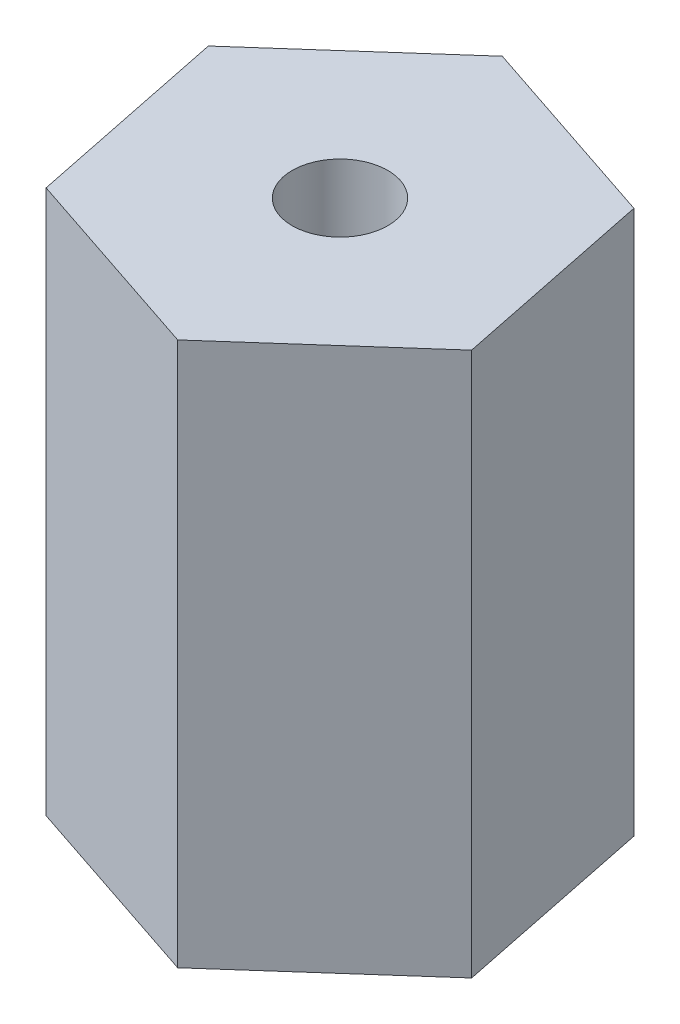
ISO-10303-21;
HEADER;
FILE_DESCRIPTION(('STEP AP214'),'2;1');
FILE_NAME('part.step','',(''),(''),'','','');
FILE_SCHEMA(('AUTOMOTIVE_DESIGN { 1 0 10303 214 1 1 1 1 }'));
ENDSEC;
DATA;
#1=APPLICATION_CONTEXT('core data for automotive mechanical design processes');
#2=APPLICATION_PROTOCOL_DEFINITION('international standard','automotive_design',2000,#1);
#3=PRODUCT_CONTEXT('',#1,'mechanical');
#4=PRODUCT('Part','Part','',(#3));
#5=PRODUCT_RELATED_PRODUCT_CATEGORY('part','',(#4));
#6=PRODUCT_DEFINITION_FORMATION('','',#4);
#7=PRODUCT_DEFINITION_CONTEXT('part definition',#1,'design');
#8=PRODUCT_DEFINITION('design','',#6,#7);
#9=PRODUCT_DEFINITION_SHAPE('','',#8);
#10=(LENGTH_UNIT() NAMED_UNIT(*) SI_UNIT(.MILLI.,.METRE.));
#11=(NAMED_UNIT(*) PLANE_ANGLE_UNIT() SI_UNIT($,.RADIAN.));
#12=(NAMED_UNIT(*) SI_UNIT($,.STERADIAN.) SOLID_ANGLE_UNIT());
#13=UNCERTAINTY_MEASURE_WITH_UNIT(LENGTH_MEASURE(1.E-05),#10,'distance_accuracy_value','');
#14=(GEOMETRIC_REPRESENTATION_CONTEXT(3) GLOBAL_UNCERTAINTY_ASSIGNED_CONTEXT((#13)) GLOBAL_UNIT_ASSIGNED_CONTEXT((#10,
#11,#12)) REPRESENTATION_CONTEXT('',''));
#15=CARTESIAN_POINT('',(0.,0.,0.));
#16=DIRECTION('',(0.,0.,1.));
#17=DIRECTION('',(1.,0.,0.));
#18=AXIS2_PLACEMENT_3D('',#15,#16,#17);
#19=CARTESIAN_POINT('',(6.53815754550503,18.000000068,2.18123296405703));
#20=DIRECTION('',(-0.979748657790497,0.,0.200231285162231));
#21=DIRECTION('',(0.200231285162231,0.,0.979748657790498));
#22=AXIS2_PLACEMENT_3D('',#19,#20,#21);
#23=PLANE('',#22);
#24=DIRECTION('',(-0.200231285162231,0.,-0.979748657790497));
#25=VECTOR('',#24,1.);
#26=CARTESIAN_POINT('',(6.53815754550503,0.,2.18123296405703));
#27=LINE('',#26,#25);
#28=CARTESIAN_POINT('',(6.53815754550503,0.,2.18123296405703));
#29=VERTEX_POINT('',#28);
#30=CARTESIAN_POINT('',(5.15808193119793,0.,-4.57159404632375));
#31=VERTEX_POINT('',#30);
#32=EDGE_CURVE('E118',#29,#31,#27,.T.);
#33=ORIENTED_EDGE('',*,*,#32,.T.);
#34=DIRECTION('',(0.,-1.,0.));
#35=VECTOR('',#34,1.);
#36=CARTESIAN_POINT('',(5.15808193119793,18.000000068,-4.57159404632375));
#37=LINE('',#36,#35);
#38=CARTESIAN_POINT('',(5.15808193119793,18.000000068,-4.57159404632375));
#39=VERTEX_POINT('',#38);
#40=EDGE_CURVE('E11',#39,#31,#37,.T.);
#41=ORIENTED_EDGE('',*,*,#40,.F.);
#42=DIRECTION('',(-0.200231285162231,0.,-0.979748657790497));
#43=VECTOR('',#42,1.);
#44=CARTESIAN_POINT('',(6.53815754550503,18.000000068,2.18123296405703));
#45=LINE('',#44,#43);
#46=CARTESIAN_POINT('',(6.53815754550503,18.000000068,2.18123296405703));
#47=VERTEX_POINT('',#46);
#48=EDGE_CURVE('E129',#47,#39,#45,.T.);
#49=ORIENTED_EDGE('',*,*,#48,.F.);
#50=DIRECTION('',(0.,-1.,0.));
#51=VECTOR('',#50,1.);
#52=CARTESIAN_POINT('',(6.53815754550503,18.000000068,2.18123296405703));
#53=LINE('',#52,#51);
#54=EDGE_CURVE('E114',#47,#29,#53,.T.);
#55=ORIENTED_EDGE('',*,*,#54,.T.);
#56=EDGE_LOOP('',(#33,#41,#49,#55));
#57=FACE_BOUND('',#56,.T.);
#58=ADVANCED_FACE('F34',(#57),#23,.F.);
#59=CARTESIAN_POINT('',(5.15808193119793,18.000000068,-4.57159404632375));
#60=DIRECTION('',(-0.31646894931235,0.,0.948602869551393));
#61=DIRECTION('',(0.948602869551393,0.,0.31646894931235));
#62=AXIS2_PLACEMENT_3D('',#59,#60,#61);
#63=PLANE('',#62);
#64=DIRECTION('',(-0.948602869551393,0.,-0.31646894931235));
#65=VECTOR('',#64,1.);
#66=CARTESIAN_POINT('',(5.15808193119793,0.,-4.57159404632375));
#67=LINE('',#66,#65);
#68=CARTESIAN_POINT('',(-1.38007561430709,0.,-6.75282701038078));
#69=VERTEX_POINT('',#68);
#70=EDGE_CURVE('E121',#31,#69,#67,.T.);
#71=ORIENTED_EDGE('',*,*,#70,.T.);
#72=DIRECTION('',(0.,-1.,0.));
#73=VECTOR('',#72,1.);
#74=CARTESIAN_POINT('',(-1.38007561430709,18.000000068,-6.75282701038078));
#75=LINE('',#74,#73);
#76=CARTESIAN_POINT('',(-1.38007561430709,18.000000068,-6.75282701038078));
#77=VERTEX_POINT('',#76);
#78=EDGE_CURVE('E42',#77,#69,#75,.T.);
#79=ORIENTED_EDGE('',*,*,#78,.F.);
#80=DIRECTION('',(-0.948602869551393,0.,-0.31646894931235));
#81=VECTOR('',#80,1.);
#82=CARTESIAN_POINT('',(5.15808193119793,18.000000068,-4.57159404632375));
#83=LINE('',#82,#81);
#84=EDGE_CURVE('E87',#39,#77,#83,.T.);
#85=ORIENTED_EDGE('',*,*,#84,.F.);
#86=ORIENTED_EDGE('',*,*,#40,.T.);
#87=EDGE_LOOP('',(#71,#79,#85,#86));
#88=FACE_BOUND('',#87,.T.);
#89=ADVANCED_FACE('F154',(#88),#63,.F.);
#90=CARTESIAN_POINT('',(-1.38007561430709,18.000000068,-6.75282701038078));
#91=DIRECTION('',(0.663279708478147,0.,0.748371584389162));
#92=DIRECTION('',(0.748371584389162,0.,-0.663279708478147));
#93=AXIS2_PLACEMENT_3D('',#90,#91,#92);
#94=PLANE('',#93);
#95=DIRECTION('',(-0.748371584389162,0.,0.663279708478147));
#96=VECTOR('',#95,1.);
#97=CARTESIAN_POINT('',(-1.38007561430709,0.,-6.75282701038078));
#98=LINE('',#97,#96);
#99=CARTESIAN_POINT('',(-6.53815754550502,0.,-2.18123296405703));
#100=VERTEX_POINT('',#99);
#101=EDGE_CURVE('E124',#69,#100,#98,.T.);
#102=ORIENTED_EDGE('',*,*,#101,.T.);
#103=DIRECTION('',(0.,-1.,0.));
#104=VECTOR('',#103,1.);
#105=CARTESIAN_POINT('',(-6.53815754550502,18.000000068,-2.18123296405703));
#106=LINE('',#105,#104);
#107=CARTESIAN_POINT('',(-6.53815754550502,18.000000068,-2.18123296405703));
#108=VERTEX_POINT('',#107);
#109=EDGE_CURVE('E109',#108,#100,#106,.T.);
#110=ORIENTED_EDGE('',*,*,#109,.F.);
#111=DIRECTION('',(-0.748371584389162,0.,0.663279708478147));
#112=VECTOR('',#111,1.);
#113=CARTESIAN_POINT('',(-1.38007561430709,18.000000068,-6.75282701038078));
#114=LINE('',#113,#112);
#115=EDGE_CURVE('E100',#77,#108,#114,.T.);
#116=ORIENTED_EDGE('',*,*,#115,.F.);
#117=ORIENTED_EDGE('',*,*,#78,.T.);
#118=EDGE_LOOP('',(#102,#110,#116,#117));
#119=FACE_BOUND('',#118,.T.);
#120=ADVANCED_FACE('F135',(#119),#94,.F.);
#121=CARTESIAN_POINT('',(-6.53815754550502,18.000000068,-2.18123296405703));
#122=DIRECTION('',(0.979748657790497,0.,-0.200231285162231));
#123=DIRECTION('',(-0.200231285162231,0.,-0.979748657790498));
#124=AXIS2_PLACEMENT_3D('',#121,#122,#123);
#125=PLANE('',#124);
#126=DIRECTION('',(0.200231285162231,0.,0.979748657790497));
#127=VECTOR('',#126,1.);
#128=CARTESIAN_POINT('',(-6.53815754550502,0.,-2.18123296405703));
#129=LINE('',#128,#127);
#130=CARTESIAN_POINT('',(-5.15808193119793,0.,4.57159404632375));
#131=VERTEX_POINT('',#130);
#132=EDGE_CURVE('E108',#100,#131,#129,.T.);
#133=ORIENTED_EDGE('',*,*,#132,.T.);
#134=DIRECTION('',(0.,-1.,0.));
#135=VECTOR('',#134,1.);
#136=CARTESIAN_POINT('',(-5.15808193119793,18.000000068,4.57159404632375));
#137=LINE('',#136,#135);
#138=CARTESIAN_POINT('',(-5.15808193119793,18.000000068,4.57159404632375));
#139=VERTEX_POINT('',#138);
#140=EDGE_CURVE('E105',#139,#131,#137,.T.);
#141=ORIENTED_EDGE('',*,*,#140,.F.);
#142=DIRECTION('',(0.200231285162231,0.,0.979748657790497));
#143=VECTOR('',#142,1.);
#144=CARTESIAN_POINT('',(-6.53815754550502,18.000000068,-2.18123296405703));
#145=LINE('',#144,#143);
#146=EDGE_CURVE('E94',#108,#139,#145,.T.);
#147=ORIENTED_EDGE('',*,*,#146,.F.);
#148=ORIENTED_EDGE('',*,*,#109,.T.);
#149=EDGE_LOOP('',(#133,#141,#147,#148));
#150=FACE_BOUND('',#149,.T.);
#151=ADVANCED_FACE('F106',(#150),#125,.F.);
#152=CARTESIAN_POINT('',(-5.15808193119793,18.000000068,4.57159404632375));
#153=DIRECTION('',(0.31646894931235,0.,-0.948602869551393));
#154=DIRECTION('',(-0.948602869551393,0.,-0.31646894931235));
#155=AXIS2_PLACEMENT_3D('',#152,#153,#154);
#156=PLANE('',#155);
#157=DIRECTION('',(0.948602869551393,0.,0.31646894931235));
#158=VECTOR('',#157,1.);
#159=CARTESIAN_POINT('',(-5.15808193119793,0.,4.57159404632375));
#160=LINE('',#159,#158);
#161=CARTESIAN_POINT('',(1.38007561430709,0.,6.75282701038078));
#162=VERTEX_POINT('',#161);
#163=EDGE_CURVE('E73',#131,#162,#160,.T.);
#164=ORIENTED_EDGE('',*,*,#163,.T.);
#165=DIRECTION('',(0.,-1.,0.));
#166=VECTOR('',#165,1.);
#167=CARTESIAN_POINT('',(1.38007561430709,18.000000068,6.75282701038078));
#168=LINE('',#167,#166);
#169=CARTESIAN_POINT('',(1.38007561430709,18.000000068,6.75282701038078));
#170=VERTEX_POINT('',#169);
#171=EDGE_CURVE('E110',#170,#162,#168,.T.);
#172=ORIENTED_EDGE('',*,*,#171,.F.);
#173=DIRECTION('',(0.948602869551393,0.,0.31646894931235));
#174=VECTOR('',#173,1.);
#175=CARTESIAN_POINT('',(-5.15808193119793,18.000000068,4.57159404632375));
#176=LINE('',#175,#174);
#177=EDGE_CURVE('E98',#139,#170,#176,.T.);
#178=ORIENTED_EDGE('',*,*,#177,.F.);
#179=ORIENTED_EDGE('',*,*,#140,.T.);
#180=EDGE_LOOP('',(#164,#172,#178,#179));
#181=FACE_BOUND('',#180,.T.);
#182=ADVANCED_FACE('F112',(#181),#156,.F.);
#183=CARTESIAN_POINT('',(1.38007561430709,18.000000068,6.75282701038078));
#184=DIRECTION('',(-0.663279708478147,0.,-0.748371584389162));
#185=DIRECTION('',(-0.748371584389162,0.,0.663279708478147));
#186=AXIS2_PLACEMENT_3D('',#183,#184,#185);
#187=PLANE('',#186);
#188=DIRECTION('',(0.748371584389162,0.,-0.663279708478147));
#189=VECTOR('',#188,1.);
#190=CARTESIAN_POINT('',(1.38007561430709,0.,6.75282701038078));
#191=LINE('',#190,#189);
#192=EDGE_CURVE('E79',#162,#29,#191,.T.);
#193=ORIENTED_EDGE('',*,*,#192,.T.);
#194=ORIENTED_EDGE('',*,*,#54,.F.);
#195=DIRECTION('',(0.748371584389162,0.,-0.663279708478147));
#196=VECTOR('',#195,1.);
#197=CARTESIAN_POINT('',(1.38007561430709,18.000000068,6.75282701038078));
#198=LINE('',#197,#196);
#199=EDGE_CURVE('E50',#170,#47,#198,.T.);
#200=ORIENTED_EDGE('',*,*,#199,.F.);
#201=ORIENTED_EDGE('',*,*,#171,.T.);
#202=EDGE_LOOP('',(#193,#194,#200,#201));
#203=FACE_BOUND('',#202,.T.);
#204=ADVANCED_FACE('F142',(#203),#187,.F.);
#205=CARTESIAN_POINT('',(0.,18.000000068,0.));
#206=DIRECTION('',(0.,1.,0.));
#207=DIRECTION('',(0.,0.,1.));
#208=AXIS2_PLACEMENT_3D('',#205,#206,#207);
#209=PLANE('',#208);
#210=CARTESIAN_POINT('',(0.,18.000000068,0.));
#211=DIRECTION('',(0.,1.,0.));
#212=DIRECTION('',(0.,0.,1.));
#213=AXIS2_PLACEMENT_3D('',#210,#211,#212);
#214=CIRCLE('',#213,1.585000005);
#215=CARTESIAN_POINT('',(0.,18.000000068,1.585000005));
#216=VERTEX_POINT('',#215);
#217=EDGE_CURVE('E209',#216,#216,#214,.T.);
#218=ORIENTED_EDGE('',*,*,#217,.F.);
#219=EDGE_LOOP('',(#218));
#220=FACE_BOUND('',#219,.T.);
#221=ORIENTED_EDGE('',*,*,#48,.T.);
#222=ORIENTED_EDGE('',*,*,#84,.T.);
#223=ORIENTED_EDGE('',*,*,#115,.T.);
#224=ORIENTED_EDGE('',*,*,#146,.T.);
#225=ORIENTED_EDGE('',*,*,#177,.T.);
#226=ORIENTED_EDGE('',*,*,#199,.T.);
#227=EDGE_LOOP('',(#221,#222,#223,#224,#225,#226));
#228=FACE_BOUND('',#227,.T.);
#229=ADVANCED_FACE('F96',(#220,#228),#209,.T.);
#230=CARTESIAN_POINT('',(0.,0.,0.));
#231=DIRECTION('',(0.,1.,0.));
#232=DIRECTION('',(0.,0.,1.));
#233=AXIS2_PLACEMENT_3D('',#230,#231,#232);
#234=PLANE('',#233);
#235=CARTESIAN_POINT('',(0.,0.,0.));
#236=DIRECTION('',(0.,1.,0.));
#237=DIRECTION('',(0.,0.,1.));
#238=AXIS2_PLACEMENT_3D('',#235,#236,#237);
#239=CIRCLE('',#238,1.585000005);
#240=CARTESIAN_POINT('',(0.,0.,1.585000005));
#241=VERTEX_POINT('',#240);
#242=EDGE_CURVE('E122',#241,#241,#239,.T.);
#243=ORIENTED_EDGE('',*,*,#242,.T.);
#244=EDGE_LOOP('',(#243));
#245=FACE_BOUND('',#244,.T.);
#246=ORIENTED_EDGE('',*,*,#32,.F.);
#247=ORIENTED_EDGE('',*,*,#192,.F.);
#248=ORIENTED_EDGE('',*,*,#163,.F.);
#249=ORIENTED_EDGE('',*,*,#132,.F.);
#250=ORIENTED_EDGE('',*,*,#101,.F.);
#251=ORIENTED_EDGE('',*,*,#70,.F.);
#252=EDGE_LOOP('',(#246,#247,#248,#249,#250,#251));
#253=FACE_BOUND('',#252,.T.);
#254=ADVANCED_FACE('F138',(#245,#253),#234,.F.);
#255=CARTESIAN_POINT('',(0.,0.,0.));
#256=DIRECTION('',(0.,1.,0.));
#257=DIRECTION('',(0.,0.,1.));
#258=AXIS2_PLACEMENT_3D('',#255,#256,#257);
#259=CYLINDRICAL_SURFACE('',#258,1.585000005);
#260=ORIENTED_EDGE('',*,*,#242,.F.);
#261=EDGE_LOOP('',(#260));
#262=FACE_BOUND('',#261,.T.);
#263=ORIENTED_EDGE('',*,*,#217,.T.);
#264=EDGE_LOOP('',(#263));
#265=FACE_BOUND('',#264,.T.);
#266=ADVANCED_FACE('F191',(#262,#265),#259,.F.);
#267=CLOSED_SHELL('',(#58,#89,#120,#151,#182,#204,#229,#254,#266));
#268=MANIFOLD_SOLID_BREP('B2',#267);
#269=ADVANCED_BREP_SHAPE_REPRESENTATION('',(#18,#268),#14);
#270=SHAPE_DEFINITION_REPRESENTATION(#9,#269);
ENDSEC;
END-ISO-10303-21;
